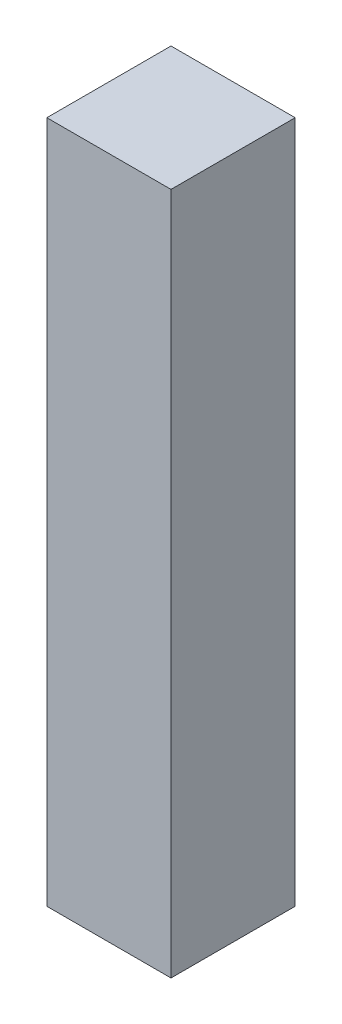
ISO-10303-21;
HEADER;
FILE_DESCRIPTION(('STEP AP214'),'2;1');
FILE_NAME('part.step','',(''),(''),'','','');
FILE_SCHEMA(('AUTOMOTIVE_DESIGN { 1 0 10303 214 1 1 1 1 }'));
ENDSEC;
DATA;
#1=APPLICATION_CONTEXT('core data for automotive mechanical design processes');
#2=APPLICATION_PROTOCOL_DEFINITION('international standard','automotive_design',2000,#1);
#3=PRODUCT_CONTEXT('',#1,'mechanical');
#4=PRODUCT('Part','Part','',(#3));
#5=PRODUCT_RELATED_PRODUCT_CATEGORY('part','',(#4));
#6=PRODUCT_DEFINITION_FORMATION('','',#4);
#7=PRODUCT_DEFINITION_CONTEXT('part definition',#1,'design');
#8=PRODUCT_DEFINITION('design','',#6,#7);
#9=PRODUCT_DEFINITION_SHAPE('','',#8);
#10=(LENGTH_UNIT() NAMED_UNIT(*) SI_UNIT(.MILLI.,.METRE.));
#11=(NAMED_UNIT(*) PLANE_ANGLE_UNIT() SI_UNIT($,.RADIAN.));
#12=(NAMED_UNIT(*) SI_UNIT($,.STERADIAN.) SOLID_ANGLE_UNIT());
#13=UNCERTAINTY_MEASURE_WITH_UNIT(LENGTH_MEASURE(1.E-05),#10,'distance_accuracy_value','');
#14=(GEOMETRIC_REPRESENTATION_CONTEXT(3) GLOBAL_UNCERTAINTY_ASSIGNED_CONTEXT((#13)) GLOBAL_UNIT_ASSIGNED_CONTEXT((#10,
#11,#12)) REPRESENTATION_CONTEXT('',''));
#15=CARTESIAN_POINT('',(0.,0.,0.));
#16=DIRECTION('',(0.,0.,1.));
#17=DIRECTION('',(1.,0.,0.));
#18=AXIS2_PLACEMENT_3D('',#15,#16,#17);
#19=CARTESIAN_POINT('',(2.5,13.75,2.5));
#20=DIRECTION('',(-1.,0.,0.));
#21=DIRECTION('',(0.,0.,1.));
#22=AXIS2_PLACEMENT_3D('',#19,#20,#21);
#23=PLANE('',#22);
#24=DIRECTION('',(0.,0.,-1.));
#25=VECTOR('',#24,1.);
#26=CARTESIAN_POINT('',(2.5,-13.75,2.5));
#27=LINE('',#26,#25);
#28=CARTESIAN_POINT('',(2.5,-13.75,2.5));
#29=VERTEX_POINT('',#28);
#30=CARTESIAN_POINT('',(2.5,-13.75,-2.5));
#31=VERTEX_POINT('',#30);
#32=EDGE_CURVE('E98',#29,#31,#27,.T.);
#33=ORIENTED_EDGE('',*,*,#32,.T.);
#34=DIRECTION('',(0.,-1.,0.));
#35=VECTOR('',#34,1.);
#36=CARTESIAN_POINT('',(2.5,13.75,-2.5));
#37=LINE('',#36,#35);
#38=CARTESIAN_POINT('',(2.5,13.75,-2.5));
#39=VERTEX_POINT('',#38);
#40=EDGE_CURVE('E11',#39,#31,#37,.T.);
#41=ORIENTED_EDGE('',*,*,#40,.F.);
#42=DIRECTION('',(0.,0.,-1.));
#43=VECTOR('',#42,1.);
#44=CARTESIAN_POINT('',(2.5,13.75,2.5));
#45=LINE('',#44,#43);
#46=CARTESIAN_POINT('',(2.5,13.75,2.5));
#47=VERTEX_POINT('',#46);
#48=EDGE_CURVE('E86',#47,#39,#45,.T.);
#49=ORIENTED_EDGE('',*,*,#48,.F.);
#50=DIRECTION('',(0.,-1.,0.));
#51=VECTOR('',#50,1.);
#52=CARTESIAN_POINT('',(2.5,13.75,2.5));
#53=LINE('',#52,#51);
#54=EDGE_CURVE('E94',#47,#29,#53,.T.);
#55=ORIENTED_EDGE('',*,*,#54,.T.);
#56=EDGE_LOOP('',(#33,#41,#49,#55));
#57=FACE_BOUND('',#56,.T.);
#58=ADVANCED_FACE('F35',(#57),#23,.F.);
#59=CARTESIAN_POINT('',(-2.5,13.75,-2.5));
#60=DIRECTION('',(0.,0.,1.));
#61=DIRECTION('',(1.,0.,0.));
#62=AXIS2_PLACEMENT_3D('',#59,#60,#61);
#63=PLANE('',#62);
#64=DIRECTION('',(-1.,0.,0.));
#65=VECTOR('',#64,1.);
#66=CARTESIAN_POINT('',(-2.5,-13.75,-2.5));
#67=LINE('',#66,#65);
#68=CARTESIAN_POINT('',(-2.5,-13.75,-2.5));
#69=VERTEX_POINT('',#68);
#70=EDGE_CURVE('E90',#31,#69,#67,.T.);
#71=ORIENTED_EDGE('',*,*,#70,.T.);
#72=DIRECTION('',(0.,-1.,0.));
#73=VECTOR('',#72,1.);
#74=CARTESIAN_POINT('',(-2.5,13.75,-2.5));
#75=LINE('',#74,#73);
#76=CARTESIAN_POINT('',(-2.5,13.75,-2.5));
#77=VERTEX_POINT('',#76);
#78=EDGE_CURVE('E43',#77,#69,#75,.T.);
#79=ORIENTED_EDGE('',*,*,#78,.F.);
#80=DIRECTION('',(-1.,0.,0.));
#81=VECTOR('',#80,1.);
#82=CARTESIAN_POINT('',(-2.5,13.75,-2.5));
#83=LINE('',#82,#81);
#84=EDGE_CURVE('E81',#39,#77,#83,.T.);
#85=ORIENTED_EDGE('',*,*,#84,.F.);
#86=ORIENTED_EDGE('',*,*,#40,.T.);
#87=EDGE_LOOP('',(#71,#79,#85,#86));
#88=FACE_BOUND('',#87,.T.);
#89=ADVANCED_FACE('F89',(#88),#63,.F.);
#90=CARTESIAN_POINT('',(-2.5,13.75,2.5));
#91=DIRECTION('',(1.,0.,0.));
#92=DIRECTION('',(0.,0.,-1.));
#93=AXIS2_PLACEMENT_3D('',#90,#91,#92);
#94=PLANE('',#93);
#95=DIRECTION('',(0.,0.,1.));
#96=VECTOR('',#95,1.);
#97=CARTESIAN_POINT('',(-2.5,-13.75,2.5));
#98=LINE('',#97,#96);
#99=CARTESIAN_POINT('',(-2.5,-13.75,2.5));
#100=VERTEX_POINT('',#99);
#101=EDGE_CURVE('E68',#69,#100,#98,.T.);
#102=ORIENTED_EDGE('',*,*,#101,.T.);
#103=DIRECTION('',(0.,-1.,0.));
#104=VECTOR('',#103,1.);
#105=CARTESIAN_POINT('',(-2.5,13.75,2.5));
#106=LINE('',#105,#104);
#107=CARTESIAN_POINT('',(-2.5,13.75,2.5));
#108=VERTEX_POINT('',#107);
#109=EDGE_CURVE('E91',#108,#100,#106,.T.);
#110=ORIENTED_EDGE('',*,*,#109,.F.);
#111=DIRECTION('',(0.,0.,1.));
#112=VECTOR('',#111,1.);
#113=CARTESIAN_POINT('',(-2.5,13.75,2.5));
#114=LINE('',#113,#112);
#115=EDGE_CURVE('E84',#77,#108,#114,.T.);
#116=ORIENTED_EDGE('',*,*,#115,.F.);
#117=ORIENTED_EDGE('',*,*,#78,.T.);
#118=EDGE_LOOP('',(#102,#110,#116,#117));
#119=FACE_BOUND('',#118,.T.);
#120=ADVANCED_FACE('F92',(#119),#94,.F.);
#121=CARTESIAN_POINT('',(-2.5,13.75,2.5));
#122=DIRECTION('',(0.,0.,-1.));
#123=DIRECTION('',(-1.,0.,0.));
#124=AXIS2_PLACEMENT_3D('',#121,#122,#123);
#125=PLANE('',#124);
#126=DIRECTION('',(1.,0.,0.));
#127=VECTOR('',#126,1.);
#128=CARTESIAN_POINT('',(-2.5,-13.75,2.5));
#129=LINE('',#128,#127);
#130=EDGE_CURVE('E74',#100,#29,#129,.T.);
#131=ORIENTED_EDGE('',*,*,#130,.T.);
#132=ORIENTED_EDGE('',*,*,#54,.F.);
#133=DIRECTION('',(1.,0.,0.));
#134=VECTOR('',#133,1.);
#135=CARTESIAN_POINT('',(-2.5,13.75,2.5));
#136=LINE('',#135,#134);
#137=EDGE_CURVE('E51',#108,#47,#136,.T.);
#138=ORIENTED_EDGE('',*,*,#137,.F.);
#139=ORIENTED_EDGE('',*,*,#109,.T.);
#140=EDGE_LOOP('',(#131,#132,#138,#139));
#141=FACE_BOUND('',#140,.T.);
#142=ADVANCED_FACE('F105',(#141),#125,.F.);
#143=CARTESIAN_POINT('',(0.,13.75,0.));
#144=DIRECTION('',(0.,-1.,0.));
#145=DIRECTION('',(0.,0.,-1.));
#146=AXIS2_PLACEMENT_3D('',#143,#144,#145);
#147=PLANE('',#146);
#148=ORIENTED_EDGE('',*,*,#48,.T.);
#149=ORIENTED_EDGE('',*,*,#84,.T.);
#150=ORIENTED_EDGE('',*,*,#115,.T.);
#151=ORIENTED_EDGE('',*,*,#137,.T.);
#152=EDGE_LOOP('',(#148,#149,#150,#151));
#153=FACE_BOUND('',#152,.T.);
#154=ADVANCED_FACE('F82',(#153),#147,.F.);
#155=CARTESIAN_POINT('',(0.,-13.75,0.));
#156=DIRECTION('',(0.,-1.,0.));
#157=DIRECTION('',(0.,0.,-1.));
#158=AXIS2_PLACEMENT_3D('',#155,#156,#157);
#159=PLANE('',#158);
#160=ORIENTED_EDGE('',*,*,#32,.F.);
#161=ORIENTED_EDGE('',*,*,#130,.F.);
#162=ORIENTED_EDGE('',*,*,#101,.F.);
#163=ORIENTED_EDGE('',*,*,#70,.F.);
#164=EDGE_LOOP('',(#160,#161,#162,#163));
#165=FACE_BOUND('',#164,.T.);
#166=ADVANCED_FACE('F108',(#165),#159,.T.);
#167=CLOSED_SHELL('',(#58,#89,#120,#142,#154,#166));
#168=MANIFOLD_SOLID_BREP('B2',#167);
#169=ADVANCED_BREP_SHAPE_REPRESENTATION('',(#18,#168),#14);
#170=SHAPE_DEFINITION_REPRESENTATION(#9,#169);
ENDSEC;
END-ISO-10303-21;
